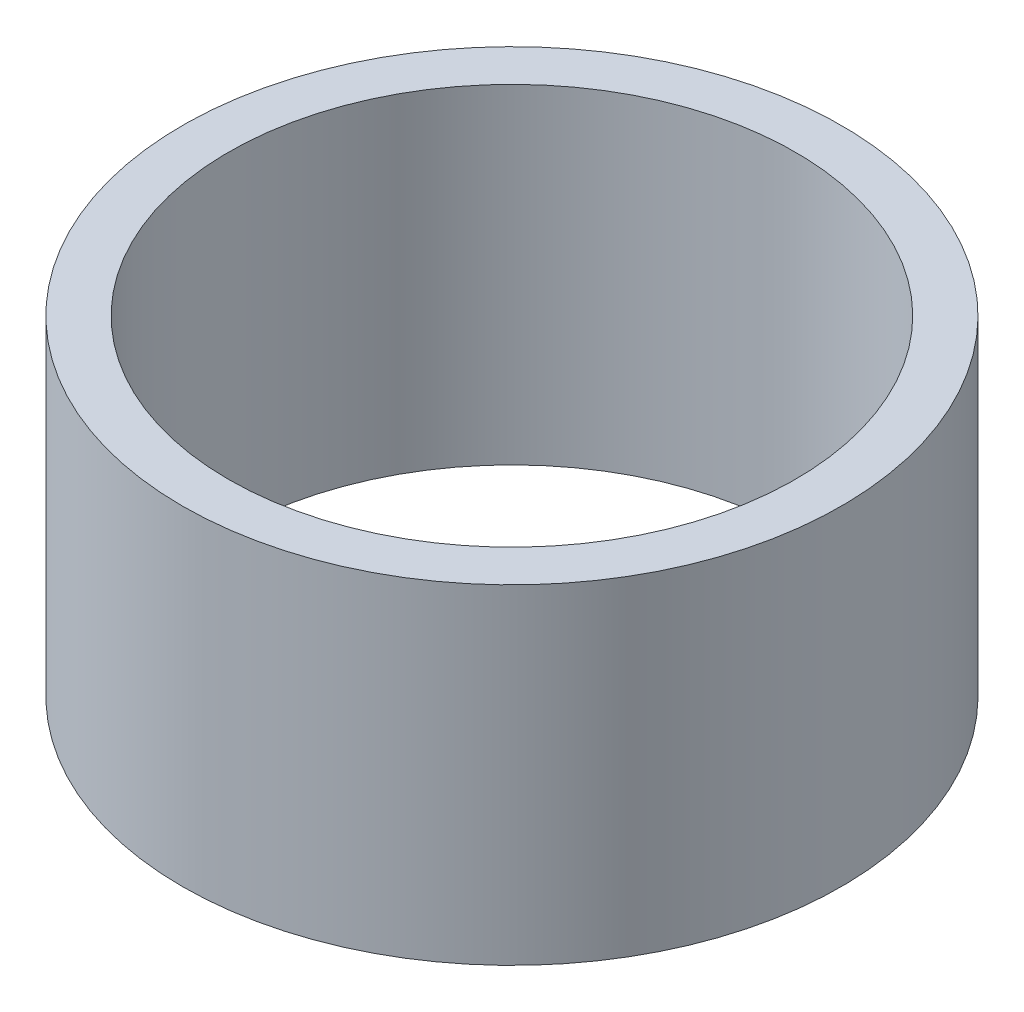
ISO-10303-21;
HEADER;
FILE_DESCRIPTION(('STEP AP214'),'2;1');
FILE_NAME('part.step','',(''),(''),'','','');
FILE_SCHEMA(('AUTOMOTIVE_DESIGN { 1 0 10303 214 1 1 1 1 }'));
ENDSEC;
DATA;
#1=APPLICATION_CONTEXT('core data for automotive mechanical design processes');
#2=APPLICATION_PROTOCOL_DEFINITION('international standard','automotive_design',2000,#1);
#3=PRODUCT_CONTEXT('',#1,'mechanical');
#4=PRODUCT('Part','Part','',(#3));
#5=PRODUCT_RELATED_PRODUCT_CATEGORY('part','',(#4));
#6=PRODUCT_DEFINITION_FORMATION('','',#4);
#7=PRODUCT_DEFINITION_CONTEXT('part definition',#1,'design');
#8=PRODUCT_DEFINITION('design','',#6,#7);
#9=PRODUCT_DEFINITION_SHAPE('','',#8);
#10=(LENGTH_UNIT() NAMED_UNIT(*) SI_UNIT(.MILLI.,.METRE.));
#11=(NAMED_UNIT(*) PLANE_ANGLE_UNIT() SI_UNIT($,.RADIAN.));
#12=(NAMED_UNIT(*) SI_UNIT($,.STERADIAN.) SOLID_ANGLE_UNIT());
#13=UNCERTAINTY_MEASURE_WITH_UNIT(LENGTH_MEASURE(1.E-05),#10,'distance_accuracy_value','');
#14=(GEOMETRIC_REPRESENTATION_CONTEXT(3) GLOBAL_UNCERTAINTY_ASSIGNED_CONTEXT((#13)) GLOBAL_UNIT_ASSIGNED_CONTEXT((#10,
#11,#12)) REPRESENTATION_CONTEXT('',''));
#15=CARTESIAN_POINT('',(0.,0.,0.));
#16=DIRECTION('',(0.,0.,1.));
#17=DIRECTION('',(1.,0.,0.));
#18=AXIS2_PLACEMENT_3D('',#15,#16,#17);
#19=CARTESIAN_POINT('',(0.,5.,0.));
#20=DIRECTION('',(0.,1.,0.));
#21=DIRECTION('',(0.,0.,1.));
#22=AXIS2_PLACEMENT_3D('',#19,#20,#21);
#23=PLANE('',#22);
#24=CARTESIAN_POINT('',(0.,5.,0.));
#25=DIRECTION('',(0.,1.,0.));
#26=DIRECTION('',(0.,0.,1.));
#27=AXIS2_PLACEMENT_3D('',#24,#25,#26);
#28=CIRCLE('',#27,5.);
#29=CARTESIAN_POINT('',(0.,5.,5.));
#30=VERTEX_POINT('',#29);
#31=EDGE_CURVE('E10',#30,#30,#28,.T.);
#32=ORIENTED_EDGE('',*,*,#31,.T.);
#33=EDGE_LOOP('',(#32));
#34=FACE_BOUND('',#33,.T.);
#35=CARTESIAN_POINT('',(0.,5.,0.));
#36=DIRECTION('',(0.,1.,0.));
#37=DIRECTION('',(0.,0.,1.));
#38=AXIS2_PLACEMENT_3D('',#35,#36,#37);
#39=CIRCLE('',#38,4.3);
#40=CARTESIAN_POINT('',(0.,5.,4.3));
#41=VERTEX_POINT('',#40);
#42=EDGE_CURVE('E46',#41,#41,#39,.T.);
#43=ORIENTED_EDGE('',*,*,#42,.F.);
#44=EDGE_LOOP('',(#43));
#45=FACE_BOUND('',#44,.T.);
#46=ADVANCED_FACE('F35',(#34,#45),#23,.T.);
#47=CARTESIAN_POINT('',(0.,0.,0.));
#48=DIRECTION('',(0.,1.,0.));
#49=DIRECTION('',(0.,0.,1.));
#50=AXIS2_PLACEMENT_3D('',#47,#48,#49);
#51=PLANE('',#50);
#52=CARTESIAN_POINT('',(0.,0.,0.));
#53=DIRECTION('',(0.,1.,0.));
#54=DIRECTION('',(0.,0.,1.));
#55=AXIS2_PLACEMENT_3D('',#52,#53,#54);
#56=CIRCLE('',#55,5.);
#57=CARTESIAN_POINT('',(0.,0.,5.));
#58=VERTEX_POINT('',#57);
#59=EDGE_CURVE('E39',#58,#58,#56,.T.);
#60=ORIENTED_EDGE('',*,*,#59,.F.);
#61=EDGE_LOOP('',(#60));
#62=FACE_BOUND('',#61,.T.);
#63=CARTESIAN_POINT('',(0.,0.,0.));
#64=DIRECTION('',(0.,1.,0.));
#65=DIRECTION('',(0.,0.,1.));
#66=AXIS2_PLACEMENT_3D('',#63,#64,#65);
#67=CIRCLE('',#66,4.3);
#68=CARTESIAN_POINT('',(0.,0.,4.3));
#69=VERTEX_POINT('',#68);
#70=EDGE_CURVE('E48',#69,#69,#67,.T.);
#71=ORIENTED_EDGE('',*,*,#70,.T.);
#72=EDGE_LOOP('',(#71));
#73=FACE_BOUND('',#72,.T.);
#74=ADVANCED_FACE('F58',(#62,#73),#51,.F.);
#75=CARTESIAN_POINT('',(0.,5.,0.));
#76=DIRECTION('',(0.,-1.,0.));
#77=DIRECTION('',(0.,0.,-1.));
#78=AXIS2_PLACEMENT_3D('',#75,#76,#77);
#79=CYLINDRICAL_SURFACE('',#78,5.);
#80=ORIENTED_EDGE('',*,*,#31,.F.);
#81=EDGE_LOOP('',(#80));
#82=FACE_BOUND('',#81,.T.);
#83=ORIENTED_EDGE('',*,*,#59,.T.);
#84=EDGE_LOOP('',(#83));
#85=FACE_BOUND('',#84,.T.);
#86=ADVANCED_FACE('F37',(#82,#85),#79,.T.);
#87=CARTESIAN_POINT('',(0.,5.,0.));
#88=DIRECTION('',(0.,-1.,0.));
#89=DIRECTION('',(0.,0.,-1.));
#90=AXIS2_PLACEMENT_3D('',#87,#88,#89);
#91=CYLINDRICAL_SURFACE('',#90,4.3);
#92=ORIENTED_EDGE('',*,*,#42,.T.);
#93=EDGE_LOOP('',(#92));
#94=FACE_BOUND('',#93,.T.);
#95=ORIENTED_EDGE('',*,*,#70,.F.);
#96=EDGE_LOOP('',(#95));
#97=FACE_BOUND('',#96,.T.);
#98=ADVANCED_FACE('F54',(#94,#97),#91,.F.);
#99=CLOSED_SHELL('',(#46,#74,#86,#98));
#100=MANIFOLD_SOLID_BREP('B2',#99);
#101=ADVANCED_BREP_SHAPE_REPRESENTATION('',(#18,#100),#14);
#102=SHAPE_DEFINITION_REPRESENTATION(#9,#101);
ENDSEC;
END-ISO-10303-21;
